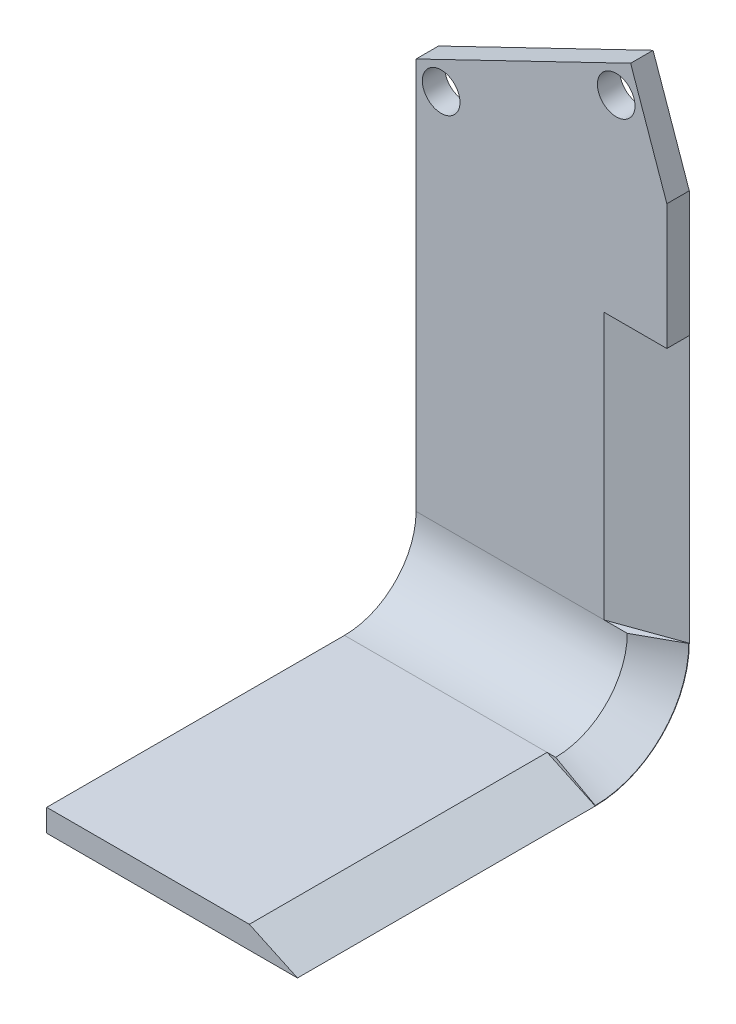
ISO-10303-21;
HEADER;
FILE_DESCRIPTION(('STEP AP214'),'2;1');
FILE_NAME('part.step','',(''),(''),'','','');
FILE_SCHEMA(('AUTOMOTIVE_DESIGN { 1 0 10303 214 1 1 1 1 }'));
ENDSEC;
DATA;
#1=APPLICATION_CONTEXT('core data for automotive mechanical design processes');
#2=APPLICATION_PROTOCOL_DEFINITION('international standard','automotive_design',2000,#1);
#3=PRODUCT_CONTEXT('',#1,'mechanical');
#4=PRODUCT('Part','Part','',(#3));
#5=PRODUCT_RELATED_PRODUCT_CATEGORY('part','',(#4));
#6=PRODUCT_DEFINITION_FORMATION('','',#4);
#7=PRODUCT_DEFINITION_CONTEXT('part definition',#1,'design');
#8=PRODUCT_DEFINITION('design','',#6,#7);
#9=PRODUCT_DEFINITION_SHAPE('','',#8);
#10=(LENGTH_UNIT() NAMED_UNIT(*) SI_UNIT(.MILLI.,.METRE.));
#11=(NAMED_UNIT(*) PLANE_ANGLE_UNIT() SI_UNIT($,.RADIAN.));
#12=(NAMED_UNIT(*) SI_UNIT($,.STERADIAN.) SOLID_ANGLE_UNIT());
#13=UNCERTAINTY_MEASURE_WITH_UNIT(LENGTH_MEASURE(1.E-05),#10,'distance_accuracy_value','');
#14=(GEOMETRIC_REPRESENTATION_CONTEXT(3) GLOBAL_UNCERTAINTY_ASSIGNED_CONTEXT((#13)) GLOBAL_UNIT_ASSIGNED_CONTEXT((#10,
#11,#12)) REPRESENTATION_CONTEXT('',''));
#15=CARTESIAN_POINT('',(0.,0.,0.));
#16=DIRECTION('',(0.,0.,1.));
#17=DIRECTION('',(1.,0.,0.));
#18=AXIS2_PLACEMENT_3D('',#15,#16,#17);
#19=CARTESIAN_POINT('',(60.3157453734695,41.5744432246713,-51.8859502667107));
#20=DIRECTION('',(1.,0.,0.));
#21=DIRECTION('',(0.,0.,-1.));
#22=AXIS2_PLACEMENT_3D('',#19,#20,#21);
#23=PLANE('',#22);
#24=DIRECTION('',(0.,-1.,0.));
#25=VECTOR('',#24,1.);
#26=CARTESIAN_POINT('',(60.3157453734695,41.5744432246713,-64.1301605350602));
#27=LINE('',#26,#25);
#28=CARTESIAN_POINT('',(60.3157453734695,108.585226216952,-64.1301605350602));
#29=VERTEX_POINT('',#28);
#30=CARTESIAN_POINT('',(60.3157453734695,87.1417756594219,-64.1301605350602));
#31=VERTEX_POINT('',#30);
#32=EDGE_CURVE('E186',#29,#31,#27,.T.);
#33=ORIENTED_EDGE('',*,*,#32,.T.);
#34=DIRECTION('',(0.,0.,1.));
#35=VECTOR('',#34,1.);
#36=CARTESIAN_POINT('',(60.3157453734695,87.1417756594219,-64.1301605350602));
#37=LINE('',#36,#35);
#38=CARTESIAN_POINT('',(60.3157453734695,87.1417756594219,-67.968538184858));
#39=VERTEX_POINT('',#38);
#40=EDGE_CURVE('E295',#39,#31,#37,.T.);
#41=ORIENTED_EDGE('',*,*,#40,.F.);
#42=DIRECTION('',(0.,1.,0.));
#43=VECTOR('',#42,1.);
#44=CARTESIAN_POINT('',(60.3157453734695,41.5744432246714,-67.968538184858));
#45=LINE('',#44,#43);
#46=CARTESIAN_POINT('',(60.3157453734695,108.585226216952,-67.968538184858));
#47=VERTEX_POINT('',#46);
#48=EDGE_CURVE('E167',#39,#47,#45,.T.);
#49=ORIENTED_EDGE('',*,*,#48,.T.);
#50=DIRECTION('',(0.,0.,1.));
#51=VECTOR('',#50,1.);
#52=CARTESIAN_POINT('',(60.3157453734695,108.585226216952,-64.1301605350602));
#53=LINE('',#52,#51);
#54=EDGE_CURVE('E184',#47,#29,#53,.T.);
#55=ORIENTED_EDGE('',*,*,#54,.T.);
#56=EDGE_LOOP('',(#33,#41,#49,#55));
#57=FACE_BOUND('',#56,.T.);
#58=ADVANCED_FACE('F45',(#57),#23,.T.);
#59=CARTESIAN_POINT('',(60.3157453734695,41.5744432246713,-64.1301605350602));
#60=DIRECTION('',(0.,0.,-1.));
#61=DIRECTION('',(-1.,0.,0.));
#62=AXIS2_PLACEMENT_3D('',#59,#60,#61);
#63=PLANE('',#62);
#64=CARTESIAN_POINT('',(21.717534369916,105.893170878647,-64.1301605350602));
#65=DIRECTION('',(0.,0.,1.));
#66=DIRECTION('',(1.,0.,0.));
#67=AXIS2_PLACEMENT_3D('',#64,#65,#66);
#68=CIRCLE('',#67,3.21651758362946);
#69=CARTESIAN_POINT('',(24.9340519535455,105.893170878647,-64.1301605350602));
#70=VERTEX_POINT('',#69);
#71=EDGE_CURVE('E248',#70,#70,#68,.T.);
#72=ORIENTED_EDGE('',*,*,#71,.F.);
#73=EDGE_LOOP('',(#72));
#74=FACE_BOUND('',#73,.T.);
#75=CARTESIAN_POINT('',(51.6585813116659,120.345429426407,-64.1301605350602));
#76=DIRECTION('',(0.,0.,1.));
#77=DIRECTION('',(1.,0.,0.));
#78=AXIS2_PLACEMENT_3D('',#75,#76,#77);
#79=CIRCLE('',#78,3.21651758362946);
#80=CARTESIAN_POINT('',(54.8750988952954,120.345429426407,-64.1301605350602));
#81=VERTEX_POINT('',#80);
#82=EDGE_CURVE('E245',#81,#81,#79,.T.);
#83=ORIENTED_EDGE('',*,*,#82,.F.);
#84=EDGE_LOOP('',(#83));
#85=FACE_BOUND('',#84,.T.);
#86=DIRECTION('',(0.,1.,0.));
#87=VECTOR('',#86,1.);
#88=CARTESIAN_POINT('',(49.5940200947047,41.5744432246713,-64.1301605350602));
#89=LINE('',#88,#87);
#90=CARTESIAN_POINT('',(49.5940200947047,41.5744432246713,-64.1301605350602));
#91=VERTEX_POINT('',#90);
#92=CARTESIAN_POINT('',(49.5940200947047,87.1417756594219,-64.1301605350602));
#93=VERTEX_POINT('',#92);
#94=EDGE_CURVE('E144',#91,#93,#89,.T.);
#95=ORIENTED_EDGE('',*,*,#94,.T.);
#96=DIRECTION('',(-1.,0.,0.));
#97=VECTOR('',#96,1.);
#98=CARTESIAN_POINT('',(49.5940200947047,87.1417756594219,-64.1301605350602));
#99=LINE('',#98,#97);
#100=EDGE_CURVE('E293',#31,#93,#99,.T.);
#101=ORIENTED_EDGE('',*,*,#100,.F.);
#102=ORIENTED_EDGE('',*,*,#32,.F.);
#103=DIRECTION('',(-0.330178571428571,0.943918487460325,0.));
#104=VECTOR('',#103,1.);
#105=CARTESIAN_POINT('',(54.1205984858332,126.295986956121,-64.1301605350602));
#106=LINE('',#105,#104);
#107=CARTESIAN_POINT('',(54.1205984858332,126.295986956121,-64.1301605350602));
#108=VERTEX_POINT('',#107);
#109=EDGE_CURVE('E244',#29,#108,#106,.T.);
#110=ORIENTED_EDGE('',*,*,#109,.T.);
#111=DIRECTION('',(-0.900575657894737,-0.434699303435676,0.));
#112=VECTOR('',#111,1.);
#113=CARTESIAN_POINT('',(17.4288442584101,108.585226216952,-64.1301605350602));
#114=LINE('',#113,#112);
#115=CARTESIAN_POINT('',(17.4288442584101,108.585226216952,-64.1301605350602));
#116=VERTEX_POINT('',#115);
#117=EDGE_CURVE('E257',#108,#116,#114,.T.);
#118=ORIENTED_EDGE('',*,*,#117,.T.);
#119=DIRECTION('',(0.,-1.,0.));
#120=VECTOR('',#119,1.);
#121=CARTESIAN_POINT('',(17.4288442584101,41.5744432246713,-64.1301605350602));
#122=LINE('',#121,#120);
#123=CARTESIAN_POINT('',(17.4288442584101,41.5744432246713,-64.1301605350602));
#124=VERTEX_POINT('',#123);
#125=EDGE_CURVE('E205',#116,#124,#122,.T.);
#126=ORIENTED_EDGE('',*,*,#125,.T.);
#127=DIRECTION('',(-1.,0.,0.));
#128=VECTOR('',#127,1.);
#129=CARTESIAN_POINT('',(60.3157453734695,41.5744432246713,-64.1301605350602));
#130=LINE('',#129,#128);
#131=EDGE_CURVE('E218',#91,#124,#130,.T.);
#132=ORIENTED_EDGE('',*,*,#131,.F.);
#133=EDGE_LOOP('',(#95,#101,#102,#110,#118,#126,#132));
#134=FACE_BOUND('',#133,.T.);
#135=ADVANCED_FACE('F292',(#74,#85,#134),#63,.F.);
#136=DIRECTION('',(0.,0.,1.));
#137=VECTOR('',#136,1.);
#138=CARTESIAN_POINT('',(60.3157453734695,41.5744432246713,-64.1301605350602));
#139=LINE('',#138,#137);
#140=CARTESIAN_POINT('',(60.3157453734695,41.5744432246713,-67.968538184858));
#141=VERTEX_POINT('',#140);
#142=CARTESIAN_POINT('',(60.3157453734695,41.5744432246713,-67.8827643826279));
#143=VERTEX_POINT('',#142);
#144=EDGE_CURVE('E147',#141,#143,#139,.T.);
#145=ORIENTED_EDGE('',*,*,#144,.T.);
#146=CARTESIAN_POINT('',(60.3157453734695,41.5744432246713,-51.8859502667107));
#147=DIRECTION('',(1.,0.,0.));
#148=DIRECTION('',(0.,0.,-1.));
#149=AXIS2_PLACEMENT_3D('',#146,#147,#148);
#150=CIRCLE('',#149,15.9968141159172);
#151=CARTESIAN_POINT('',(60.3157453734695,25.5776291087541,-51.8859502667107));
#152=VERTEX_POINT('',#151);
#153=EDGE_CURVE('E224',#143,#152,#150,.F.);
#154=ORIENTED_EDGE('',*,*,#153,.T.);
#155=DIRECTION('',(0.,1.,0.));
#156=VECTOR('',#155,1.);
#157=CARTESIAN_POINT('',(60.3157453734695,29.3302329563218,-51.8859502667107));
#158=LINE('',#157,#156);
#159=CARTESIAN_POINT('',(60.3157453734695,25.491855306524,-51.8859502667106));
#160=VERTEX_POINT('',#159);
#161=EDGE_CURVE('E163',#160,#152,#158,.T.);
#162=ORIENTED_EDGE('',*,*,#161,.F.);
#163=CARTESIAN_POINT('',(60.3157453734695,41.5744432246713,-51.8859502667107));
#164=DIRECTION('',(1.,0.,0.));
#165=DIRECTION('',(0.,0.,-1.));
#166=AXIS2_PLACEMENT_3D('',#163,#164,#165);
#167=CIRCLE('',#166,16.0825879181473);
#168=EDGE_CURVE('E160',#160,#141,#167,.T.);
#169=ORIENTED_EDGE('',*,*,#168,.T.);
#170=EDGE_LOOP('',(#145,#154,#162,#169));
#171=FACE_BOUND('',#170,.T.);
#172=ADVANCED_FACE('F162',(#171),#23,.T.);
#173=CARTESIAN_POINT('',(60.3157453734695,25.491855306524,-0.957755192577629));
#174=DIRECTION('',(0.,0.,-1.));
#175=DIRECTION('',(-1.,0.,0.));
#176=AXIS2_PLACEMENT_3D('',#173,#174,#175);
#177=PLANE('',#176);
#178=DIRECTION('',(-1.,0.,0.));
#179=VECTOR('',#178,1.);
#180=CARTESIAN_POINT('',(60.3157453734695,25.491855306524,-0.957755192577629));
#181=LINE('',#180,#179);
#182=CARTESIAN_POINT('',(60.3157453734695,25.491855306524,-0.957755192577629));
#183=VERTEX_POINT('',#182);
#184=CARTESIAN_POINT('',(17.4288442584101,25.491855306524,-0.957755192577629));
#185=VERTEX_POINT('',#184);
#186=EDGE_CURVE('E221',#183,#185,#181,.T.);
#187=ORIENTED_EDGE('',*,*,#186,.F.);
#188=DIRECTION('',(0.906307787036649,-0.4226182617407,0.));
#189=VECTOR('',#188,1.);
#190=CARTESIAN_POINT('',(60.3157453734695,25.491855306524,-0.957755192577629));
#191=LINE('',#190,#189);
#192=CARTESIAN_POINT('',(52.0843179399489,29.3302329563218,-0.957755192577629));
#193=VERTEX_POINT('',#192);
#194=EDGE_CURVE('E231',#193,#183,#191,.T.);
#195=ORIENTED_EDGE('',*,*,#194,.F.);
#196=DIRECTION('',(-1.,0.,0.));
#197=VECTOR('',#196,1.);
#198=CARTESIAN_POINT('',(60.3157453734695,29.3302329563218,-0.957755192577629));
#199=LINE('',#198,#197);
#200=CARTESIAN_POINT('',(17.4288442584101,29.3302329563218,-0.957755192577629));
#201=VERTEX_POINT('',#200);
#202=EDGE_CURVE('E192',#193,#201,#199,.T.);
#203=ORIENTED_EDGE('',*,*,#202,.T.);
#204=DIRECTION('',(0.,-1.,0.));
#205=VECTOR('',#204,1.);
#206=CARTESIAN_POINT('',(17.4288442584101,25.491855306524,-0.957755192577629));
#207=LINE('',#206,#205);
#208=EDGE_CURVE('E193',#201,#185,#207,.T.);
#209=ORIENTED_EDGE('',*,*,#208,.T.);
#210=EDGE_LOOP('',(#187,#195,#203,#209));
#211=FACE_BOUND('',#210,.T.);
#212=ADVANCED_FACE('F273',(#211),#177,.F.);
#213=CARTESIAN_POINT('',(60.3157453734695,25.491855306524,-0.957755192577629));
#214=DIRECTION('',(0.,1.,0.));
#215=DIRECTION('',(0.,0.,1.));
#216=AXIS2_PLACEMENT_3D('',#213,#214,#215);
#217=PLANE('',#216);
#218=DIRECTION('',(0.,0.,-1.));
#219=VECTOR('',#218,1.);
#220=CARTESIAN_POINT('',(17.4288442584101,25.491855306524,-0.957755192577629));
#221=LINE('',#220,#219);
#222=CARTESIAN_POINT('',(17.4288442584101,25.491855306524,-51.8859502667106));
#223=VERTEX_POINT('',#222);
#224=EDGE_CURVE('E196',#185,#223,#221,.T.);
#225=ORIENTED_EDGE('',*,*,#224,.T.);
#226=DIRECTION('',(-1.,0.,0.));
#227=VECTOR('',#226,1.);
#228=CARTESIAN_POINT('',(60.3157453734695,25.491855306524,-51.8859502667106));
#229=LINE('',#228,#227);
#230=EDGE_CURVE('E178',#160,#223,#229,.T.);
#231=ORIENTED_EDGE('',*,*,#230,.F.);
#232=DIRECTION('',(0.,0.,-1.));
#233=VECTOR('',#232,1.);
#234=CARTESIAN_POINT('',(60.3157453734695,25.491855306524,-0.957755192577629));
#235=LINE('',#234,#233);
#236=EDGE_CURVE('E168',#183,#160,#235,.T.);
#237=ORIENTED_EDGE('',*,*,#236,.F.);
#238=ORIENTED_EDGE('',*,*,#186,.T.);
#239=EDGE_LOOP('',(#225,#231,#237,#238));
#240=FACE_BOUND('',#239,.T.);
#241=ADVANCED_FACE('F271',(#240),#217,.F.);
#242=CARTESIAN_POINT('',(60.3157453734695,41.5744432246713,-51.8859502667107));
#243=DIRECTION('',(-1.,0.,0.));
#244=DIRECTION('',(0.,0.,1.));
#245=AXIS2_PLACEMENT_3D('',#242,#243,#244);
#246=CYLINDRICAL_SURFACE('',#245,16.0825879181473);
#247=CARTESIAN_POINT('',(17.4288442584101,41.5744432246713,-51.8859502667107));
#248=DIRECTION('',(1.,0.,0.));
#249=DIRECTION('',(0.,0.,-1.));
#250=AXIS2_PLACEMENT_3D('',#247,#248,#249);
#251=CIRCLE('',#250,16.0825879181473);
#252=CARTESIAN_POINT('',(17.4288442584101,41.5744432246713,-67.968538184858));
#253=VERTEX_POINT('',#252);
#254=EDGE_CURVE('E174',#223,#253,#251,.T.);
#255=ORIENTED_EDGE('',*,*,#254,.T.);
#256=DIRECTION('',(-1.,0.,0.));
#257=VECTOR('',#256,1.);
#258=CARTESIAN_POINT('',(60.3157453734695,41.5744432246713,-67.968538184858));
#259=LINE('',#258,#257);
#260=EDGE_CURVE('E171',#141,#253,#259,.T.);
#261=ORIENTED_EDGE('',*,*,#260,.F.);
#262=ORIENTED_EDGE('',*,*,#168,.F.);
#263=ORIENTED_EDGE('',*,*,#230,.T.);
#264=EDGE_LOOP('',(#255,#261,#262,#263));
#265=FACE_BOUND('',#264,.T.);
#266=ADVANCED_FACE('F172',(#265),#246,.T.);
#267=CARTESIAN_POINT('',(60.3157453734695,41.5744432246714,-67.968538184858));
#268=DIRECTION('',(0.,0.,1.));
#269=DIRECTION('',(1.,0.,0.));
#270=AXIS2_PLACEMENT_3D('',#267,#268,#269);
#271=PLANE('',#270);
#272=CARTESIAN_POINT('',(51.6585813116659,120.345429426407,-67.968538184858));
#273=DIRECTION('',(0.,0.,1.));
#274=DIRECTION('',(1.,0.,0.));
#275=AXIS2_PLACEMENT_3D('',#272,#273,#274);
#276=CIRCLE('',#275,3.21651758362946);
#277=CARTESIAN_POINT('',(54.8750988952954,120.345429426407,-67.968538184858));
#278=VERTEX_POINT('',#277);
#279=EDGE_CURVE('E241',#278,#278,#276,.T.);
#280=ORIENTED_EDGE('',*,*,#279,.T.);
#281=EDGE_LOOP('',(#280));
#282=FACE_BOUND('',#281,.T.);
#283=CARTESIAN_POINT('',(21.717534369916,105.893170878647,-67.968538184858));
#284=DIRECTION('',(0.,0.,1.));
#285=DIRECTION('',(1.,0.,0.));
#286=AXIS2_PLACEMENT_3D('',#283,#284,#285);
#287=CIRCLE('',#286,3.21651758362946);
#288=CARTESIAN_POINT('',(24.9340519535455,105.893170878647,-67.968538184858));
#289=VERTEX_POINT('',#288);
#290=EDGE_CURVE('E240',#289,#289,#287,.T.);
#291=ORIENTED_EDGE('',*,*,#290,.T.);
#292=EDGE_LOOP('',(#291));
#293=FACE_BOUND('',#292,.T.);
#294=DIRECTION('',(0.,1.,0.));
#295=VECTOR('',#294,1.);
#296=CARTESIAN_POINT('',(17.4288442584101,41.5744432246714,-67.968538184858));
#297=LINE('',#296,#295);
#298=CARTESIAN_POINT('',(17.4288442584101,108.585226216952,-67.968538184858));
#299=VERTEX_POINT('',#298);
#300=EDGE_CURVE('E200',#253,#299,#297,.T.);
#301=ORIENTED_EDGE('',*,*,#300,.T.);
#302=DIRECTION('',(-0.900575657894737,-0.434699303435676,0.));
#303=VECTOR('',#302,1.);
#304=CARTESIAN_POINT('',(17.4288442584101,108.585226216952,-67.968538184858));
#305=LINE('',#304,#303);
#306=CARTESIAN_POINT('',(54.1205984858332,126.295986956121,-67.968538184858));
#307=VERTEX_POINT('',#306);
#308=EDGE_CURVE('E256',#307,#299,#305,.T.);
#309=ORIENTED_EDGE('',*,*,#308,.F.);
#310=DIRECTION('',(-0.330178571428571,0.943918487460325,0.));
#311=VECTOR('',#310,1.);
#312=CARTESIAN_POINT('',(54.1205984858332,126.295986956121,-67.968538184858));
#313=LINE('',#312,#311);
#314=EDGE_CURVE('E253',#47,#307,#313,.T.);
#315=ORIENTED_EDGE('',*,*,#314,.F.);
#316=ORIENTED_EDGE('',*,*,#48,.F.);
#317=EDGE_CURVE('E141',#141,#39,#45,.T.);
#318=ORIENTED_EDGE('',*,*,#317,.F.);
#319=ORIENTED_EDGE('',*,*,#260,.T.);
#320=EDGE_LOOP('',(#301,#309,#315,#316,#318,#319));
#321=FACE_BOUND('',#320,.T.);
#322=ADVANCED_FACE('F182',(#282,#293,#321),#271,.F.);
#323=CARTESIAN_POINT('',(60.3157453734695,41.5744432246713,-51.8859502667107));
#324=DIRECTION('',(-1.,0.,0.));
#325=DIRECTION('',(0.,0.,1.));
#326=AXIS2_PLACEMENT_3D('',#323,#324,#325);
#327=CYLINDRICAL_SURFACE('',#326,12.2442102683495);
#328=DIRECTION('',(-1.,0.,0.));
#329=VECTOR('',#328,1.);
#330=CARTESIAN_POINT('',(60.3157453734695,29.3302329563218,-51.8859502667106));
#331=LINE('',#330,#329);
#332=CARTESIAN_POINT('',(53.5458688258421,29.3302329563218,-51.8859502667106));
#333=VERTEX_POINT('',#332);
#334=CARTESIAN_POINT('',(52.0843179399489,29.3302329563218,-51.8859502667107));
#335=VERTEX_POINT('',#334);
#336=EDGE_CURVE('E216',#333,#335,#331,.T.);
#337=ORIENTED_EDGE('',*,*,#336,.F.);
#338=CARTESIAN_POINT('',(53.5458688258421,41.5744432246713,-51.8859502667107));
#339=DIRECTION('',(1.,0.,0.));
#340=DIRECTION('',(0.,0.,-1.));
#341=AXIS2_PLACEMENT_3D('',#338,#339,#340);
#342=CIRCLE('',#341,12.2442102683495);
#343=CARTESIAN_POINT('',(53.5458688258421,41.5744432246713,-64.1301605350602));
#344=VERTEX_POINT('',#343);
#345=EDGE_CURVE('E53',#333,#344,#342,.T.);
#346=ORIENTED_EDGE('',*,*,#345,.T.);
#347=EDGE_CURVE('E179',#344,#91,#130,.T.);
#348=ORIENTED_EDGE('',*,*,#347,.T.);
#349=ORIENTED_EDGE('',*,*,#131,.T.);
#350=CARTESIAN_POINT('',(17.4288442584101,41.5744432246713,-51.8859502667107));
#351=DIRECTION('',(-1.,0.,0.));
#352=DIRECTION('',(0.,0.,-1.));
#353=AXIS2_PLACEMENT_3D('',#350,#351,#352);
#354=CIRCLE('',#353,12.2442102683495);
#355=CARTESIAN_POINT('',(17.4288442584101,29.3302329563218,-51.8859502667106));
#356=VERTEX_POINT('',#355);
#357=EDGE_CURVE('E208',#124,#356,#354,.T.);
#358=ORIENTED_EDGE('',*,*,#357,.T.);
#359=EDGE_CURVE('E215',#335,#356,#331,.T.);
#360=ORIENTED_EDGE('',*,*,#359,.F.);
#361=EDGE_LOOP('',(#337,#346,#348,#349,#358,#360));
#362=FACE_BOUND('',#361,.T.);
#363=ADVANCED_FACE('F328',(#362),#327,.F.);
#364=CARTESIAN_POINT('',(60.3157453734695,29.3302329563218,-0.957755192577629));
#365=DIRECTION('',(0.,-1.,0.));
#366=DIRECTION('',(0.,0.,-1.));
#367=AXIS2_PLACEMENT_3D('',#364,#365,#366);
#368=PLANE('',#367);
#369=ORIENTED_EDGE('',*,*,#202,.F.);
#370=DIRECTION('',(0.,0.,1.));
#371=VECTOR('',#370,1.);
#372=CARTESIAN_POINT('',(52.0843179399489,29.3302329563218,-51.8859502667107));
#373=LINE('',#372,#371);
#374=EDGE_CURVE('E233',#335,#193,#373,.T.);
#375=ORIENTED_EDGE('',*,*,#374,.F.);
#376=ORIENTED_EDGE('',*,*,#359,.T.);
#377=DIRECTION('',(0.,0.,1.));
#378=VECTOR('',#377,1.);
#379=CARTESIAN_POINT('',(17.4288442584101,29.3302329563218,-0.957755192577629));
#380=LINE('',#379,#378);
#381=EDGE_CURVE('E211',#356,#201,#380,.T.);
#382=ORIENTED_EDGE('',*,*,#381,.T.);
#383=EDGE_LOOP('',(#369,#375,#376,#382));
#384=FACE_BOUND('',#383,.T.);
#385=ADVANCED_FACE('F333',(#384),#368,.F.);
#386=CARTESIAN_POINT('',(17.4288442584101,41.5744432246713,-51.8859502667107));
#387=DIRECTION('',(1.,0.,0.));
#388=DIRECTION('',(0.,0.,-1.));
#389=AXIS2_PLACEMENT_3D('',#386,#387,#388);
#390=PLANE('',#389);
#391=ORIENTED_EDGE('',*,*,#208,.F.);
#392=ORIENTED_EDGE('',*,*,#381,.F.);
#393=ORIENTED_EDGE('',*,*,#357,.F.);
#394=ORIENTED_EDGE('',*,*,#125,.F.);
#395=DIRECTION('',(0.,0.,1.));
#396=VECTOR('',#395,1.);
#397=CARTESIAN_POINT('',(17.4288442584101,108.585226216952,-64.1301605350602));
#398=LINE('',#397,#396);
#399=EDGE_CURVE('E202',#299,#116,#398,.T.);
#400=ORIENTED_EDGE('',*,*,#399,.F.);
#401=ORIENTED_EDGE('',*,*,#300,.F.);
#402=ORIENTED_EDGE('',*,*,#254,.F.);
#403=ORIENTED_EDGE('',*,*,#224,.F.);
#404=EDGE_LOOP('',(#391,#392,#393,#394,#400,#401,#402,#403));
#405=FACE_BOUND('',#404,.T.);
#406=ADVANCED_FACE('F278',(#405),#390,.F.);
#407=CARTESIAN_POINT('',(17.4288442584101,108.585226216952,-67.968538184858));
#408=DIRECTION('',(-0.434699303435676,0.900575657894737,0.));
#409=DIRECTION('',(-0.900575657894737,-0.434699303435676,0.));
#410=AXIS2_PLACEMENT_3D('',#407,#408,#409);
#411=PLANE('',#410);
#412=ORIENTED_EDGE('',*,*,#117,.F.);
#413=DIRECTION('',(0.,0.,1.));
#414=VECTOR('',#413,1.);
#415=CARTESIAN_POINT('',(54.1205984858332,126.295986956121,-67.968538184858));
#416=LINE('',#415,#414);
#417=EDGE_CURVE('E197',#307,#108,#416,.T.);
#418=ORIENTED_EDGE('',*,*,#417,.F.);
#419=ORIENTED_EDGE('',*,*,#308,.T.);
#420=ORIENTED_EDGE('',*,*,#399,.T.);
#421=EDGE_LOOP('',(#412,#418,#419,#420));
#422=FACE_BOUND('',#421,.T.);
#423=ADVANCED_FACE('F283',(#422),#411,.T.);
#424=CARTESIAN_POINT('',(54.1205984858332,126.295986956121,-67.968538184858));
#425=DIRECTION('',(0.943918487460325,0.330178571428571,0.));
#426=DIRECTION('',(-0.330178571428571,0.943918487460325,0.));
#427=AXIS2_PLACEMENT_3D('',#424,#425,#426);
#428=PLANE('',#427);
#429=ORIENTED_EDGE('',*,*,#109,.F.);
#430=ORIENTED_EDGE('',*,*,#54,.F.);
#431=ORIENTED_EDGE('',*,*,#314,.T.);
#432=ORIENTED_EDGE('',*,*,#417,.T.);
#433=EDGE_LOOP('',(#429,#430,#431,#432));
#434=FACE_BOUND('',#433,.T.);
#435=ADVANCED_FACE('F287',(#434),#428,.T.);
#436=CARTESIAN_POINT('',(21.717534369916,105.893170878647,-67.968538184858));
#437=DIRECTION('',(0.,0.,1.));
#438=DIRECTION('',(1.,0.,0.));
#439=AXIS2_PLACEMENT_3D('',#436,#437,#438);
#440=CYLINDRICAL_SURFACE('',#439,3.21651758362946);
#441=CARTESIAN_POINT('',(24.9340519535455,105.893170878647,-67.968538184858));
#442=CARTESIAN_POINT('',(24.9340519535455,105.893170878647,-67.9285550843393));
#443=CARTESIAN_POINT('',(24.9340519535455,105.893170878647,-67.8885719838205));
#444=CARTESIAN_POINT('',(24.9340519535455,105.893170878647,-67.8086057827831));
#445=CARTESIAN_POINT('',(24.9340519535455,105.893170878647,-67.7686226822644));
#446=CARTESIAN_POINT('',(24.9340519535455,105.893170878647,-67.6886564812269));
#447=CARTESIAN_POINT('',(24.9340519535455,105.893170878647,-67.6486733807082));
#448=CARTESIAN_POINT('',(24.9340519535455,105.893170878647,-67.5687071796707));
#449=CARTESIAN_POINT('',(24.9340519535455,105.893170878647,-67.528724079152));
#450=CARTESIAN_POINT('',(24.9340519535455,105.893170878647,-67.4487578781145));
#451=CARTESIAN_POINT('',(24.9340519535455,105.893170878647,-67.4087747775958));
#452=CARTESIAN_POINT('',(24.9340519535455,105.893170878647,-67.3288085765584));
#453=CARTESIAN_POINT('',(24.9340519535455,105.893170878647,-67.2888254760396));
#454=CARTESIAN_POINT('',(24.9340519535455,105.893170878647,-67.2088592750022));
#455=CARTESIAN_POINT('',(24.9340519535455,105.893170878647,-67.1688761744834));
#456=CARTESIAN_POINT('',(24.9340519535455,105.893170878647,-67.088909973446));
#457=CARTESIAN_POINT('',(24.9340519535455,105.893170878647,-67.0489268729273));
#458=CARTESIAN_POINT('',(24.9340519535455,105.893170878647,-66.9689606718898));
#459=CARTESIAN_POINT('',(24.9340519535455,105.893170878647,-66.9289775713711));
#460=CARTESIAN_POINT('',(24.9340519535455,105.893170878647,-66.8490113703336));
#461=CARTESIAN_POINT('',(24.9340519535455,105.893170878647,-66.8090282698149));
#462=CARTESIAN_POINT('',(24.9340519535455,105.893170878647,-66.7290620687775));
#463=CARTESIAN_POINT('',(24.9340519535455,105.893170878647,-66.6890789682587));
#464=CARTESIAN_POINT('',(24.9340519535455,105.893170878647,-66.6091127672213));
#465=CARTESIAN_POINT('',(24.9340519535455,105.893170878647,-66.5691296667025));
#466=CARTESIAN_POINT('',(24.9340519535455,105.893170878647,-66.4891634656651));
#467=CARTESIAN_POINT('',(24.9340519535455,105.893170878647,-66.4491803651464));
#468=CARTESIAN_POINT('',(24.9340519535455,105.893170878647,-66.3692141641089));
#469=CARTESIAN_POINT('',(24.9340519535455,105.893170878647,-66.3292310635902));
#470=CARTESIAN_POINT('',(24.9340519535455,105.893170878647,-66.2492648625527));
#471=CARTESIAN_POINT('',(24.9340519535455,105.893170878647,-66.209281762034));
#472=CARTESIAN_POINT('',(24.9340519535455,105.893170878647,-66.1293155609965));
#473=CARTESIAN_POINT('',(24.9340519535455,105.893170878647,-66.0893324604778));
#474=CARTESIAN_POINT('',(24.9340519535455,105.893170878647,-66.0093662594404));
#475=CARTESIAN_POINT('',(24.9340519535455,105.893170878647,-65.9693831589216));
#476=CARTESIAN_POINT('',(24.9340519535455,105.893170878647,-65.8894169578842));
#477=CARTESIAN_POINT('',(24.9340519535455,105.893170878647,-65.8494338573654));
#478=CARTESIAN_POINT('',(24.9340519535455,105.893170878647,-65.769467656328));
#479=CARTESIAN_POINT('',(24.9340519535455,105.893170878647,-65.7294845558093));
#480=CARTESIAN_POINT('',(24.9340519535455,105.893170878647,-65.6495183547718));
#481=CARTESIAN_POINT('',(24.9340519535455,105.893170878647,-65.6095352542531));
#482=CARTESIAN_POINT('',(24.9340519535455,105.893170878647,-65.5295690532156));
#483=CARTESIAN_POINT('',(24.9340519535455,105.893170878647,-65.4895859526969));
#484=CARTESIAN_POINT('',(24.9340519535455,105.893170878647,-65.4096197516594));
#485=CARTESIAN_POINT('',(24.9340519535455,105.893170878647,-65.3696366511407));
#486=CARTESIAN_POINT('',(24.9340519535455,105.893170878647,-65.2896704501033));
#487=CARTESIAN_POINT('',(24.9340519535455,105.893170878647,-65.2496873495845));
#488=CARTESIAN_POINT('',(24.9340519535455,105.893170878647,-65.1697211485471));
#489=CARTESIAN_POINT('',(24.9340519535455,105.893170878647,-65.1297380480284));
#490=CARTESIAN_POINT('',(24.9340519535455,105.893170878647,-65.0497718469909));
#491=CARTESIAN_POINT('',(24.9340519535455,105.893170878647,-65.0097887464722));
#492=CARTESIAN_POINT('',(24.9340519535455,105.893170878647,-64.9298225454347));
#493=CARTESIAN_POINT('',(24.9340519535455,105.893170878647,-64.889839444916));
#494=CARTESIAN_POINT('',(24.9340519535455,105.893170878647,-64.8098732438785));
#495=CARTESIAN_POINT('',(24.9340519535455,105.893170878647,-64.7698901433598));
#496=CARTESIAN_POINT('',(24.9340519535455,105.893170878647,-64.6899239423223));
#497=CARTESIAN_POINT('',(24.9340519535455,105.893170878647,-64.6499408418036));
#498=CARTESIAN_POINT('',(24.9340519535455,105.893170878647,-64.5699746407662));
#499=CARTESIAN_POINT('',(24.9340519535455,105.893170878647,-64.5299915402474));
#500=CARTESIAN_POINT('',(24.9340519535455,105.893170878647,-64.45002533921));
#501=CARTESIAN_POINT('',(24.9340519535455,105.893170878647,-64.4100422386912));
#502=CARTESIAN_POINT('',(24.9340519535455,105.893170878647,-64.3300760376538));
#503=CARTESIAN_POINT('',(24.9340519535455,105.893170878647,-64.2900929371351));
#504=CARTESIAN_POINT('',(24.9340519535455,105.893170878647,-64.2101267360976));
#505=CARTESIAN_POINT('',(24.9340519535455,105.893170878647,-64.1701436355789));
#506=CARTESIAN_POINT('',(24.9340519535455,105.893170878647,-64.1301605350602));
#507=B_SPLINE_CURVE_WITH_KNOTS('',3,(#441,#442,#443,#444,#445,#446,#447,#448,#449,#450,#451,
#452,#453,#454,#455,#456,#457,#458,#459,#460,#461,#462,#463,#464,#465,#466,#467,#468,#469,#470,
#471,#472,#473,#474,#475,#476,#477,#478,#479,#480,#481,#482,#483,#484,#485,#486,#487,#488,#489,
#490,#491,#492,#493,#494,#495,#496,#497,#498,#499,#500,#501,#502,#503,#504,#505,#506),
.UNSPECIFIED.,.F.,.F.,(4,2,2,2,2,2,2,2,2,2,2,2,2,2,2,2,2,2,2,2,2,2,2,2,2,2,2,2,2,2,2,2,4),(0.,
0.119949301556177,0.239898603112354,0.359847904668545,0.479797206224722,0.599746507780899,
0.71969580933709,0.839645110893267,0.959594412449444,1.07954371400563,1.19949301556181,
1.319442317118,1.43939161867418,1.55934092023036,1.67929022178655,1.79923952334272,
1.9191888248989,2.03913812645509,2.15908742801127,2.27903672956746,2.39898603112364,
2.51893533267981,2.63888463423601,2.75883393579218,2.87878323734836,2.99873253890455,
3.11868184046073,3.23863114201692,3.35858044357309,3.47852974512927,3.59847904668546,
3.71842834824164,3.83837764979782),.UNSPECIFIED.);
#508=EDGE_CURVE('BSEAM344',#289,#70,#507,.T.);
#509=ORIENTED_EDGE('',*,*,#290,.F.);
#510=ORIENTED_EDGE('',*,*,#71,.T.);
#511=ORIENTED_EDGE('',*,*,#508,.T.);
#512=ORIENTED_EDGE('',*,*,#508,.F.);
#513=EDGE_LOOP('',(#509,#511,#510,#512));
#514=FACE_BOUND('',#513,.T.);
#515=ADVANCED_FACE('F344',(#514),#440,.F.);
#516=CARTESIAN_POINT('',(51.6585813116659,120.345429426407,-67.968538184858));
#517=DIRECTION('',(0.,0.,1.));
#518=DIRECTION('',(1.,0.,0.));
#519=AXIS2_PLACEMENT_3D('',#516,#517,#518);
#520=CYLINDRICAL_SURFACE('',#519,3.21651758362946);
#521=CARTESIAN_POINT('',(54.8750988952954,120.345429426407,-67.968538184858));
#522=CARTESIAN_POINT('',(54.8750988952954,120.345429426407,-67.9285550843393));
#523=CARTESIAN_POINT('',(54.8750988952954,120.345429426407,-67.8885719838205));
#524=CARTESIAN_POINT('',(54.8750988952954,120.345429426407,-67.8086057827831));
#525=CARTESIAN_POINT('',(54.8750988952954,120.345429426407,-67.7686226822644));
#526=CARTESIAN_POINT('',(54.8750988952954,120.345429426407,-67.6886564812269));
#527=CARTESIAN_POINT('',(54.8750988952954,120.345429426407,-67.6486733807082));
#528=CARTESIAN_POINT('',(54.8750988952954,120.345429426407,-67.5687071796707));
#529=CARTESIAN_POINT('',(54.8750988952954,120.345429426407,-67.528724079152));
#530=CARTESIAN_POINT('',(54.8750988952954,120.345429426407,-67.4487578781145));
#531=CARTESIAN_POINT('',(54.8750988952954,120.345429426407,-67.4087747775958));
#532=CARTESIAN_POINT('',(54.8750988952954,120.345429426407,-67.3288085765584));
#533=CARTESIAN_POINT('',(54.8750988952954,120.345429426407,-67.2888254760396));
#534=CARTESIAN_POINT('',(54.8750988952954,120.345429426407,-67.2088592750022));
#535=CARTESIAN_POINT('',(54.8750988952954,120.345429426407,-67.1688761744834));
#536=CARTESIAN_POINT('',(54.8750988952954,120.345429426407,-67.088909973446));
#537=CARTESIAN_POINT('',(54.8750988952954,120.345429426407,-67.0489268729273));
#538=CARTESIAN_POINT('',(54.8750988952954,120.345429426407,-66.9689606718898));
#539=CARTESIAN_POINT('',(54.8750988952954,120.345429426407,-66.9289775713711));
#540=CARTESIAN_POINT('',(54.8750988952954,120.345429426407,-66.8490113703336));
#541=CARTESIAN_POINT('',(54.8750988952954,120.345429426407,-66.8090282698149));
#542=CARTESIAN_POINT('',(54.8750988952954,120.345429426407,-66.7290620687775));
#543=CARTESIAN_POINT('',(54.8750988952954,120.345429426407,-66.6890789682587));
#544=CARTESIAN_POINT('',(54.8750988952954,120.345429426407,-66.6091127672213));
#545=CARTESIAN_POINT('',(54.8750988952954,120.345429426407,-66.5691296667025));
#546=CARTESIAN_POINT('',(54.8750988952954,120.345429426407,-66.4891634656651));
#547=CARTESIAN_POINT('',(54.8750988952954,120.345429426407,-66.4491803651464));
#548=CARTESIAN_POINT('',(54.8750988952954,120.345429426407,-66.3692141641089));
#549=CARTESIAN_POINT('',(54.8750988952954,120.345429426407,-66.3292310635902));
#550=CARTESIAN_POINT('',(54.8750988952954,120.345429426407,-66.2492648625527));
#551=CARTESIAN_POINT('',(54.8750988952954,120.345429426407,-66.209281762034));
#552=CARTESIAN_POINT('',(54.8750988952954,120.345429426407,-66.1293155609965));
#553=CARTESIAN_POINT('',(54.8750988952954,120.345429426407,-66.0893324604778));
#554=CARTESIAN_POINT('',(54.8750988952954,120.345429426407,-66.0093662594404));
#555=CARTESIAN_POINT('',(54.8750988952954,120.345429426407,-65.9693831589216));
#556=CARTESIAN_POINT('',(54.8750988952954,120.345429426407,-65.8894169578842));
#557=CARTESIAN_POINT('',(54.8750988952954,120.345429426407,-65.8494338573654));
#558=CARTESIAN_POINT('',(54.8750988952954,120.345429426407,-65.769467656328));
#559=CARTESIAN_POINT('',(54.8750988952954,120.345429426407,-65.7294845558093));
#560=CARTESIAN_POINT('',(54.8750988952954,120.345429426407,-65.6495183547718));
#561=CARTESIAN_POINT('',(54.8750988952954,120.345429426407,-65.6095352542531));
#562=CARTESIAN_POINT('',(54.8750988952954,120.345429426407,-65.5295690532156));
#563=CARTESIAN_POINT('',(54.8750988952954,120.345429426407,-65.4895859526969));
#564=CARTESIAN_POINT('',(54.8750988952954,120.345429426407,-65.4096197516594));
#565=CARTESIAN_POINT('',(54.8750988952954,120.345429426407,-65.3696366511407));
#566=CARTESIAN_POINT('',(54.8750988952954,120.345429426407,-65.2896704501033));
#567=CARTESIAN_POINT('',(54.8750988952954,120.345429426407,-65.2496873495845));
#568=CARTESIAN_POINT('',(54.8750988952954,120.345429426407,-65.1697211485471));
#569=CARTESIAN_POINT('',(54.8750988952954,120.345429426407,-65.1297380480284));
#570=CARTESIAN_POINT('',(54.8750988952954,120.345429426407,-65.0497718469909));
#571=CARTESIAN_POINT('',(54.8750988952954,120.345429426407,-65.0097887464722));
#572=CARTESIAN_POINT('',(54.8750988952954,120.345429426407,-64.9298225454347));
#573=CARTESIAN_POINT('',(54.8750988952954,120.345429426407,-64.889839444916));
#574=CARTESIAN_POINT('',(54.8750988952954,120.345429426407,-64.8098732438785));
#575=CARTESIAN_POINT('',(54.8750988952954,120.345429426407,-64.7698901433598));
#576=CARTESIAN_POINT('',(54.8750988952954,120.345429426407,-64.6899239423223));
#577=CARTESIAN_POINT('',(54.8750988952954,120.345429426407,-64.6499408418036));
#578=CARTESIAN_POINT('',(54.8750988952954,120.345429426407,-64.5699746407662));
#579=CARTESIAN_POINT('',(54.8750988952954,120.345429426407,-64.5299915402474));
#580=CARTESIAN_POINT('',(54.8750988952954,120.345429426407,-64.45002533921));
#581=CARTESIAN_POINT('',(54.8750988952954,120.345429426407,-64.4100422386912));
#582=CARTESIAN_POINT('',(54.8750988952954,120.345429426407,-64.3300760376538));
#583=CARTESIAN_POINT('',(54.8750988952954,120.345429426407,-64.2900929371351));
#584=CARTESIAN_POINT('',(54.8750988952954,120.345429426407,-64.2101267360976));
#585=CARTESIAN_POINT('',(54.8750988952954,120.345429426407,-64.1701436355789));
#586=CARTESIAN_POINT('',(54.8750988952954,120.345429426407,-64.1301605350602));
#587=B_SPLINE_CURVE_WITH_KNOTS('',3,(#521,#522,#523,#524,#525,#526,#527,#528,#529,#530,#531,
#532,#533,#534,#535,#536,#537,#538,#539,#540,#541,#542,#543,#544,#545,#546,#547,#548,#549,#550,
#551,#552,#553,#554,#555,#556,#557,#558,#559,#560,#561,#562,#563,#564,#565,#566,#567,#568,#569,
#570,#571,#572,#573,#574,#575,#576,#577,#578,#579,#580,#581,#582,#583,#584,#585,#586),
.UNSPECIFIED.,.F.,.F.,(4,2,2,2,2,2,2,2,2,2,2,2,2,2,2,2,2,2,2,2,2,2,2,2,2,2,2,2,2,2,2,2,4),(0.,
0.119949301556177,0.239898603112354,0.359847904668545,0.479797206224722,0.599746507780899,
0.71969580933709,0.839645110893267,0.959594412449444,1.07954371400563,1.19949301556181,
1.319442317118,1.43939161867418,1.55934092023036,1.67929022178655,1.79923952334272,
1.9191888248989,2.03913812645509,2.15908742801127,2.27903672956746,2.39898603112364,
2.51893533267981,2.63888463423601,2.75883393579218,2.87878323734836,2.99873253890455,
3.11868184046073,3.23863114201692,3.35858044357309,3.47852974512927,3.59847904668546,
3.71842834824164,3.83837764979782),.UNSPECIFIED.);
#588=EDGE_CURVE('BSEAM348',#278,#81,#587,.T.);
#589=ORIENTED_EDGE('',*,*,#279,.F.);
#590=ORIENTED_EDGE('',*,*,#82,.T.);
#591=ORIENTED_EDGE('',*,*,#588,.T.);
#592=ORIENTED_EDGE('',*,*,#588,.F.);
#593=EDGE_LOOP('',(#589,#591,#590,#592));
#594=FACE_BOUND('',#593,.T.);
#595=ADVANCED_FACE('F348',(#594),#520,.F.);
#596=CARTESIAN_POINT('',(60.3157453734695,25.491855306524,-51.8859502667107));
#597=DIRECTION('',(-0.422618261740701,-0.90630778703665,0.));
#598=DIRECTION('',(0.90630778703665,-0.422618261740701,0.));
#599=AXIS2_PLACEMENT_3D('',#596,#597,#598);
#600=PLANE('',#599);
#601=ORIENTED_EDGE('',*,*,#194,.T.);
#602=ORIENTED_EDGE('',*,*,#236,.T.);
#603=DIRECTION('',(0.906307787036649,-0.4226182617407,0.));
#604=VECTOR('',#603,1.);
#605=CARTESIAN_POINT('',(60.3157453734695,25.491855306524,-51.8859502667107));
#606=LINE('',#605,#604);
#607=EDGE_CURVE('E229',#335,#160,#606,.T.);
#608=ORIENTED_EDGE('',*,*,#607,.F.);
#609=ORIENTED_EDGE('',*,*,#374,.T.);
#610=EDGE_LOOP('',(#601,#602,#608,#609));
#611=FACE_BOUND('',#610,.T.);
#612=ADVANCED_FACE('F266',(#611),#600,.F.);
#613=CARTESIAN_POINT('',(17.4288442584101,25.491855306524,-51.8859502667107));
#614=DIRECTION('',(0.,0.,1.));
#615=DIRECTION('',(1.,0.,0.));
#616=AXIS2_PLACEMENT_3D('',#613,#614,#615);
#617=PLANE('',#616);
#618=ORIENTED_EDGE('',*,*,#161,.T.);
#619=DIRECTION('',(0.874619707139394,-0.484809620246339,0.));
#620=VECTOR('',#619,1.);
#621=CARTESIAN_POINT('',(31.4567287761551,41.5744432246713,-51.8859502667107));
#622=LINE('',#621,#620);
#623=EDGE_CURVE('E67',#152,#333,#622,.F.);
#624=ORIENTED_EDGE('',*,*,#623,.T.);
#625=ORIENTED_EDGE('',*,*,#336,.T.);
#626=ORIENTED_EDGE('',*,*,#607,.T.);
#627=EDGE_LOOP('',(#618,#624,#625,#626));
#628=FACE_BOUND('',#627,.T.);
#629=ADVANCED_FACE('F227',(#628),#617,.T.);
#630=CARTESIAN_POINT('',(60.3157453734695,41.5744432246713,-67.968538184858));
#631=DIRECTION('',(0.337051999660187,0.,0.941486032570356));
#632=DIRECTION('',(0.941486032570356,0.,-0.337051999660187));
#633=AXIS2_PLACEMENT_3D('',#630,#631,#632);
#634=PLANE('',#633);
#635=DIRECTION('',(0.941486032570356,0.,-0.337051999660187));
#636=VECTOR('',#635,1.);
#637=CARTESIAN_POINT('',(60.3157453734695,87.1417756594219,-67.968538184858));
#638=LINE('',#637,#636);
#639=EDGE_CURVE('E156',#93,#39,#638,.T.);
#640=ORIENTED_EDGE('',*,*,#639,.F.);
#641=ORIENTED_EDGE('',*,*,#94,.F.);
#642=DIRECTION('',(0.941486032570356,0.,-0.337051999660187));
#643=VECTOR('',#642,1.);
#644=CARTESIAN_POINT('',(60.3157453734695,41.5744432246713,-67.968538184858));
#645=LINE('',#644,#643);
#646=EDGE_CURVE('E136',#91,#141,#645,.T.);
#647=ORIENTED_EDGE('',*,*,#646,.T.);
#648=ORIENTED_EDGE('',*,*,#317,.T.);
#649=EDGE_LOOP('',(#640,#641,#647,#648));
#650=FACE_BOUND('',#649,.T.);
#651=ADVANCED_FACE('F139',(#650),#634,.T.);
#652=CARTESIAN_POINT('',(17.4288442584101,41.5744432246713,-24.040962697983));
#653=DIRECTION('',(0.,-1.,0.));
#654=DIRECTION('',(0.,0.,-1.));
#655=AXIS2_PLACEMENT_3D('',#652,#653,#654);
#656=PLANE('',#655);
#657=ORIENTED_EDGE('',*,*,#347,.F.);
#658=DIRECTION('',(0.874619707139394,0.,-0.484809620246339));
#659=VECTOR('',#658,1.);
#660=CARTESIAN_POINT('',(31.4567287761551,41.5744432246713,-51.8859502667107));
#661=LINE('',#660,#659);
#662=EDGE_CURVE('E11',#344,#143,#661,.T.);
#663=ORIENTED_EDGE('',*,*,#662,.T.);
#664=ORIENTED_EDGE('',*,*,#144,.F.);
#665=ORIENTED_EDGE('',*,*,#646,.F.);
#666=EDGE_LOOP('',(#657,#663,#664,#665));
#667=FACE_BOUND('',#666,.T.);
#668=ADVANCED_FACE('F151',(#667),#656,.F.);
#669=CARTESIAN_POINT('',(17.4288442584101,87.1417756594219,-24.040962697983));
#670=DIRECTION('',(0.,-1.,0.));
#671=DIRECTION('',(0.,0.,-1.));
#672=AXIS2_PLACEMENT_3D('',#669,#670,#671);
#673=PLANE('',#672);
#674=ORIENTED_EDGE('',*,*,#40,.T.);
#675=ORIENTED_EDGE('',*,*,#100,.T.);
#676=ORIENTED_EDGE('',*,*,#639,.T.);
#677=EDGE_LOOP('',(#674,#675,#676));
#678=FACE_BOUND('',#677,.T.);
#679=ADVANCED_FACE('F298',(#678),#673,.T.);
#680=CARTESIAN_POINT('',(60.3157453734695,41.5744432246713,-51.8859502667107));
#681=DIRECTION('',(1.,0.,0.));
#682=DIRECTION('',(0.,0.,-1.));
#683=AXIS2_PLACEMENT_3D('',#680,#681,#682);
#684=CONICAL_SURFACE('',#683,15.9968141159172,0.506145483078358);
#685=ORIENTED_EDGE('',*,*,#662,.F.);
#686=ORIENTED_EDGE('',*,*,#345,.F.);
#687=ORIENTED_EDGE('',*,*,#623,.F.);
#688=ORIENTED_EDGE('',*,*,#153,.F.);
#689=EDGE_LOOP('',(#685,#686,#687,#688));
#690=FACE_BOUND('',#689,.T.);
#691=ADVANCED_FACE('F47',(#690),#684,.F.);
#692=CLOSED_SHELL('',(#58,#135,#172,#212,#241,#266,#322,#363,#385,#406,#423,#435,#515,#595,#612,
#629,#651,#668,#679,#691));
#693=MANIFOLD_SOLID_BREP('B2',#692);
#694=ADVANCED_BREP_SHAPE_REPRESENTATION('',(#18,#693),#14);
#695=SHAPE_DEFINITION_REPRESENTATION(#9,#694);
ENDSEC;
END-ISO-10303-21;
